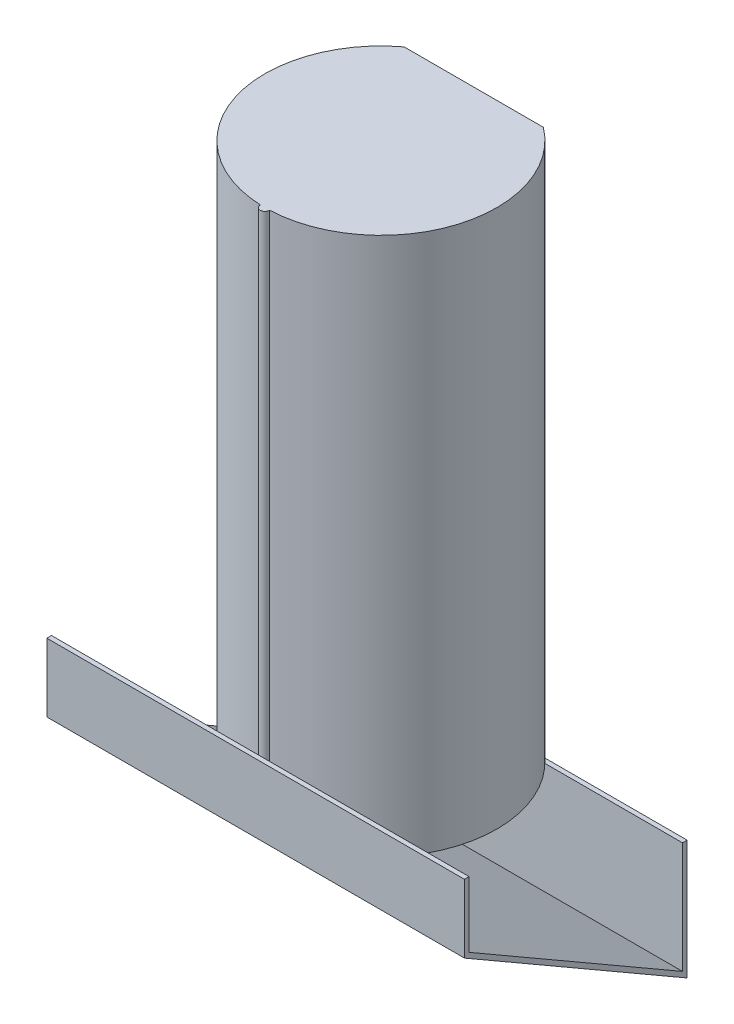
ISO-10303-21;
HEADER;
FILE_DESCRIPTION(('STEP AP214'),'2;1');
FILE_NAME('part.step','',(''),(''),'','','');
FILE_SCHEMA(('AUTOMOTIVE_DESIGN { 1 0 10303 214 1 1 1 1 }'));
ENDSEC;
DATA;
#1=APPLICATION_CONTEXT('core data for automotive mechanical design processes');
#2=APPLICATION_PROTOCOL_DEFINITION('international standard','automotive_design',2000,#1);
#3=PRODUCT_CONTEXT('',#1,'mechanical');
#4=PRODUCT('Part','Part','',(#3));
#5=PRODUCT_RELATED_PRODUCT_CATEGORY('part','',(#4));
#6=PRODUCT_DEFINITION_FORMATION('','',#4);
#7=PRODUCT_DEFINITION_CONTEXT('part definition',#1,'design');
#8=PRODUCT_DEFINITION('design','',#6,#7);
#9=PRODUCT_DEFINITION_SHAPE('','',#8);
#10=(LENGTH_UNIT() NAMED_UNIT(*) SI_UNIT(.MILLI.,.METRE.));
#11=(NAMED_UNIT(*) PLANE_ANGLE_UNIT() SI_UNIT($,.RADIAN.));
#12=(NAMED_UNIT(*) SI_UNIT($,.STERADIAN.) SOLID_ANGLE_UNIT());
#13=UNCERTAINTY_MEASURE_WITH_UNIT(LENGTH_MEASURE(1.E-05),#10,'distance_accuracy_value','');
#14=(GEOMETRIC_REPRESENTATION_CONTEXT(3) GLOBAL_UNCERTAINTY_ASSIGNED_CONTEXT((#13)) GLOBAL_UNIT_ASSIGNED_CONTEXT((#10,
#11,#12)) REPRESENTATION_CONTEXT('',''));
#15=CARTESIAN_POINT('',(0.,0.,0.));
#16=DIRECTION('',(0.,0.,1.));
#17=DIRECTION('',(1.,0.,0.));
#18=AXIS2_PLACEMENT_3D('',#15,#16,#17);
#19=CARTESIAN_POINT('',(22.5,-13.2790561913613,-10.));
#20=DIRECTION('',(0.,0.,-1.));
#21=DIRECTION('',(-1.,0.,0.));
#22=AXIS2_PLACEMENT_3D('',#19,#20,#21);
#23=PLANE('',#22);
#24=DIRECTION('',(0.,-1.,0.));
#25=VECTOR('',#24,1.);
#26=CARTESIAN_POINT('',(-22.5,-13.2790561913613,-10.));
#27=LINE('',#26,#25);
#28=CARTESIAN_POINT('',(-22.5,-1.27905619136129,-10.));
#29=VERTEX_POINT('',#28);
#30=CARTESIAN_POINT('',(-22.5,-13.2790561913613,-10.));
#31=VERTEX_POINT('',#30);
#32=EDGE_CURVE('E139',#29,#31,#27,.T.);
#33=ORIENTED_EDGE('',*,*,#32,.T.);
#34=DIRECTION('',(-1.,0.,0.));
#35=VECTOR('',#34,1.);
#36=CARTESIAN_POINT('',(22.5,-13.2790561913613,-10.));
#37=LINE('',#36,#35);
#38=CARTESIAN_POINT('',(22.5,-13.2790561913613,-10.));
#39=VERTEX_POINT('',#38);
#40=EDGE_CURVE('E12',#39,#31,#37,.T.);
#41=ORIENTED_EDGE('',*,*,#40,.F.);
#42=DIRECTION('',(0.,-1.,0.));
#43=VECTOR('',#42,1.);
#44=CARTESIAN_POINT('',(22.5,-13.2790561913613,-10.));
#45=LINE('',#44,#43);
#46=CARTESIAN_POINT('',(22.5,-1.27905619136129,-10.));
#47=VERTEX_POINT('',#46);
#48=EDGE_CURVE('E153',#47,#39,#45,.T.);
#49=ORIENTED_EDGE('',*,*,#48,.F.);
#50=DIRECTION('',(-1.,0.,0.));
#51=VECTOR('',#50,1.);
#52=CARTESIAN_POINT('',(22.5,-1.27905619136129,-10.));
#53=LINE('',#52,#51);
#54=EDGE_CURVE('E135',#47,#29,#53,.T.);
#55=ORIENTED_EDGE('',*,*,#54,.T.);
#56=EDGE_LOOP('',(#33,#41,#49,#55));
#57=FACE_BOUND('',#56,.T.);
#58=ADVANCED_FACE('F43',(#57),#23,.F.);
#59=CARTESIAN_POINT('',(22.5,0.,13.));
#60=DIRECTION('',(0.,-0.86602540378444,0.499999999999998));
#61=DIRECTION('',(0.,-0.499999999999998,-0.86602540378444));
#62=AXIS2_PLACEMENT_3D('',#59,#60,#61);
#63=PLANE('',#62);
#64=DIRECTION('',(0.,0.499999999999998,0.86602540378444));
#65=VECTOR('',#64,1.);
#66=CARTESIAN_POINT('',(-22.5,0.,13.));
#67=LINE('',#66,#65);
#68=CARTESIAN_POINT('',(-22.5,0.,13.));
#69=VERTEX_POINT('',#68);
#70=EDGE_CURVE('E142',#31,#69,#67,.T.);
#71=ORIENTED_EDGE('',*,*,#70,.T.);
#72=DIRECTION('',(-1.,0.,0.));
#73=VECTOR('',#72,1.);
#74=CARTESIAN_POINT('',(22.5,0.,13.));
#75=LINE('',#74,#73);
#76=CARTESIAN_POINT('',(22.5,0.,13.));
#77=VERTEX_POINT('',#76);
#78=EDGE_CURVE('E51',#77,#69,#75,.T.);
#79=ORIENTED_EDGE('',*,*,#78,.F.);
#80=DIRECTION('',(0.,0.499999999999998,0.86602540378444));
#81=VECTOR('',#80,1.);
#82=CARTESIAN_POINT('',(22.5,0.,13.));
#83=LINE('',#82,#81);
#84=EDGE_CURVE('E102',#39,#77,#83,.T.);
#85=ORIENTED_EDGE('',*,*,#84,.F.);
#86=ORIENTED_EDGE('',*,*,#40,.T.);
#87=EDGE_LOOP('',(#71,#79,#85,#86));
#88=FACE_BOUND('',#87,.T.);
#89=ADVANCED_FACE('F188',(#88),#63,.F.);
#90=CARTESIAN_POINT('',(22.5,0.,13.));
#91=DIRECTION('',(0.,0.,1.));
#92=DIRECTION('',(1.,0.,0.));
#93=AXIS2_PLACEMENT_3D('',#90,#91,#92);
#94=PLANE('',#93);
#95=DIRECTION('',(0.,1.,0.));
#96=VECTOR('',#95,1.);
#97=CARTESIAN_POINT('',(-22.5,0.,13.));
#98=LINE('',#97,#96);
#99=CARTESIAN_POINT('',(-22.5,7.06870368327941,13.));
#100=VERTEX_POINT('',#99);
#101=EDGE_CURVE('E144',#69,#100,#98,.T.);
#102=ORIENTED_EDGE('',*,*,#101,.T.);
#103=DIRECTION('',(-1.,0.,0.));
#104=VECTOR('',#103,1.);
#105=CARTESIAN_POINT('',(22.5,7.06870368327941,13.));
#106=LINE('',#105,#104);
#107=CARTESIAN_POINT('',(22.5,7.06870368327941,13.));
#108=VERTEX_POINT('',#107);
#109=EDGE_CURVE('E160',#108,#100,#106,.T.);
#110=ORIENTED_EDGE('',*,*,#109,.F.);
#111=DIRECTION('',(0.,1.,0.));
#112=VECTOR('',#111,1.);
#113=CARTESIAN_POINT('',(22.5,0.,13.));
#114=LINE('',#113,#112);
#115=EDGE_CURVE('E168',#77,#108,#114,.T.);
#116=ORIENTED_EDGE('',*,*,#115,.F.);
#117=ORIENTED_EDGE('',*,*,#78,.T.);
#118=EDGE_LOOP('',(#102,#110,#116,#117));
#119=FACE_BOUND('',#118,.T.);
#120=ADVANCED_FACE('F166',(#119),#94,.F.);
#121=CARTESIAN_POINT('',(22.5,7.06870368327941,13.));
#122=DIRECTION('',(0.,-1.,0.));
#123=DIRECTION('',(0.,0.,-1.));
#124=AXIS2_PLACEMENT_3D('',#121,#122,#123);
#125=PLANE('',#124);
#126=DIRECTION('',(0.,0.,1.));
#127=VECTOR('',#126,1.);
#128=CARTESIAN_POINT('',(-22.5,7.06870368327941,13.));
#129=LINE('',#128,#127);
#130=CARTESIAN_POINT('',(-22.5,7.06870368327941,13.5));
#131=VERTEX_POINT('',#130);
#132=EDGE_CURVE('E146',#100,#131,#129,.T.);
#133=ORIENTED_EDGE('',*,*,#132,.T.);
#134=DIRECTION('',(-1.,0.,0.));
#135=VECTOR('',#134,1.);
#136=CARTESIAN_POINT('',(22.5,7.06870368327941,13.5));
#137=LINE('',#136,#135);
#138=CARTESIAN_POINT('',(22.5,7.06870368327941,13.5));
#139=VERTEX_POINT('',#138);
#140=EDGE_CURVE('E157',#139,#131,#137,.T.);
#141=ORIENTED_EDGE('',*,*,#140,.F.);
#142=DIRECTION('',(0.,0.,1.));
#143=VECTOR('',#142,1.);
#144=CARTESIAN_POINT('',(22.5,7.06870368327941,13.));
#145=LINE('',#144,#143);
#146=EDGE_CURVE('E180',#108,#139,#145,.T.);
#147=ORIENTED_EDGE('',*,*,#146,.F.);
#148=ORIENTED_EDGE('',*,*,#109,.T.);
#149=EDGE_LOOP('',(#133,#141,#147,#148));
#150=FACE_BOUND('',#149,.T.);
#151=ADVANCED_FACE('F176',(#150),#125,.F.);
#152=CARTESIAN_POINT('',(22.5,7.06870368327941,13.5));
#153=DIRECTION('',(0.,0.,-1.));
#154=DIRECTION('',(0.,1.,0.));
#155=AXIS2_PLACEMENT_3D('',#152,#153,#154);
#156=PLANE('',#155);
#157=DIRECTION('',(0.,-1.,0.));
#158=VECTOR('',#157,1.);
#159=CARTESIAN_POINT('',(-22.5,7.06870368327941,13.5));
#160=LINE('',#159,#158);
#161=CARTESIAN_POINT('',(-22.5,-0.288675134594786,13.5));
#162=VERTEX_POINT('',#161);
#163=EDGE_CURVE('E148',#131,#162,#160,.T.);
#164=ORIENTED_EDGE('',*,*,#163,.T.);
#165=DIRECTION('',(-1.,0.,0.));
#166=VECTOR('',#165,1.);
#167=CARTESIAN_POINT('',(22.5,-0.288675134594786,13.5));
#168=LINE('',#167,#166);
#169=CARTESIAN_POINT('',(22.5,-0.288675134594786,13.5));
#170=VERTEX_POINT('',#169);
#171=EDGE_CURVE('E130',#170,#162,#168,.T.);
#172=ORIENTED_EDGE('',*,*,#171,.F.);
#173=DIRECTION('',(0.,-1.,0.));
#174=VECTOR('',#173,1.);
#175=CARTESIAN_POINT('',(22.5,7.06870368327941,13.5));
#176=LINE('',#175,#174);
#177=EDGE_CURVE('E121',#139,#170,#176,.T.);
#178=ORIENTED_EDGE('',*,*,#177,.F.);
#179=ORIENTED_EDGE('',*,*,#140,.T.);
#180=EDGE_LOOP('',(#164,#172,#178,#179));
#181=FACE_BOUND('',#180,.T.);
#182=ADVANCED_FACE('F179',(#181),#156,.F.);
#183=CARTESIAN_POINT('',(22.5,-0.288675134594786,13.5));
#184=DIRECTION('',(0.,0.86602540378444,-0.499999999999998));
#185=DIRECTION('',(0.,0.499999999999998,0.86602540378444));
#186=AXIS2_PLACEMENT_3D('',#183,#184,#185);
#187=PLANE('',#186);
#188=DIRECTION('',(0.,-0.499999999999998,-0.86602540378444));
#189=VECTOR('',#188,1.);
#190=CARTESIAN_POINT('',(-22.5,-0.288675134594786,13.5));
#191=LINE('',#190,#189);
#192=CARTESIAN_POINT('',(-22.5,-14.1450815951457,-10.5));
#193=VERTEX_POINT('',#192);
#194=EDGE_CURVE('E129',#162,#193,#191,.T.);
#195=ORIENTED_EDGE('',*,*,#194,.T.);
#196=DIRECTION('',(-1.,0.,0.));
#197=VECTOR('',#196,1.);
#198=CARTESIAN_POINT('',(22.5,-14.1450815951457,-10.5));
#199=LINE('',#198,#197);
#200=CARTESIAN_POINT('',(22.5,-14.1450815951457,-10.5));
#201=VERTEX_POINT('',#200);
#202=EDGE_CURVE('E126',#201,#193,#199,.T.);
#203=ORIENTED_EDGE('',*,*,#202,.F.);
#204=DIRECTION('',(0.,-0.499999999999998,-0.86602540378444));
#205=VECTOR('',#204,1.);
#206=CARTESIAN_POINT('',(22.5,-0.288675134594786,13.5));
#207=LINE('',#206,#205);
#208=EDGE_CURVE('E115',#170,#201,#207,.T.);
#209=ORIENTED_EDGE('',*,*,#208,.F.);
#210=ORIENTED_EDGE('',*,*,#171,.T.);
#211=EDGE_LOOP('',(#195,#203,#209,#210));
#212=FACE_BOUND('',#211,.T.);
#213=ADVANCED_FACE('F127',(#212),#187,.F.);
#214=CARTESIAN_POINT('',(22.5,-14.1450815951457,-10.5));
#215=DIRECTION('',(0.,0.,1.));
#216=DIRECTION('',(0.,-1.,0.));
#217=AXIS2_PLACEMENT_3D('',#214,#215,#216);
#218=PLANE('',#217);
#219=DIRECTION('',(0.,1.,0.));
#220=VECTOR('',#219,1.);
#221=CARTESIAN_POINT('',(-22.5,-14.1450815951457,-10.5));
#222=LINE('',#221,#220);
#223=CARTESIAN_POINT('',(-22.5,-1.27905619136128,-10.5));
#224=VERTEX_POINT('',#223);
#225=EDGE_CURVE('E88',#193,#224,#222,.T.);
#226=ORIENTED_EDGE('',*,*,#225,.T.);
#227=DIRECTION('',(-1.,0.,0.));
#228=VECTOR('',#227,1.);
#229=CARTESIAN_POINT('',(22.5,-1.27905619136128,-10.5));
#230=LINE('',#229,#228);
#231=CARTESIAN_POINT('',(22.5,-1.27905619136128,-10.5));
#232=VERTEX_POINT('',#231);
#233=EDGE_CURVE('E131',#232,#224,#230,.T.);
#234=ORIENTED_EDGE('',*,*,#233,.F.);
#235=DIRECTION('',(0.,1.,0.));
#236=VECTOR('',#235,1.);
#237=CARTESIAN_POINT('',(22.5,-14.1450815951457,-10.5));
#238=LINE('',#237,#236);
#239=EDGE_CURVE('E119',#201,#232,#238,.T.);
#240=ORIENTED_EDGE('',*,*,#239,.F.);
#241=ORIENTED_EDGE('',*,*,#202,.T.);
#242=EDGE_LOOP('',(#226,#234,#240,#241));
#243=FACE_BOUND('',#242,.T.);
#244=ADVANCED_FACE('F133',(#243),#218,.F.);
#245=CARTESIAN_POINT('',(22.5,-1.27905619136128,-10.5));
#246=DIRECTION('',(0.,-1.,0.));
#247=DIRECTION('',(0.,0.,-1.));
#248=AXIS2_PLACEMENT_3D('',#245,#246,#247);
#249=PLANE('',#248);
#250=DIRECTION('',(0.,0.,1.));
#251=VECTOR('',#250,1.);
#252=CARTESIAN_POINT('',(-22.5,-1.27905619136128,-10.5));
#253=LINE('',#252,#251);
#254=EDGE_CURVE('E94',#224,#29,#253,.T.);
#255=ORIENTED_EDGE('',*,*,#254,.T.);
#256=ORIENTED_EDGE('',*,*,#54,.F.);
#257=DIRECTION('',(0.,0.,1.));
#258=VECTOR('',#257,1.);
#259=CARTESIAN_POINT('',(22.5,-1.27905619136128,-10.5));
#260=LINE('',#259,#258);
#261=EDGE_CURVE('E59',#232,#47,#260,.T.);
#262=ORIENTED_EDGE('',*,*,#261,.F.);
#263=ORIENTED_EDGE('',*,*,#233,.T.);
#264=EDGE_LOOP('',(#255,#256,#262,#263));
#265=FACE_BOUND('',#264,.T.);
#266=ADVANCED_FACE('F204',(#265),#249,.F.);
#267=CARTESIAN_POINT('',(22.5,0.,0.));
#268=DIRECTION('',(1.,0.,0.));
#269=DIRECTION('',(0.,0.,-1.));
#270=AXIS2_PLACEMENT_3D('',#267,#268,#269);
#271=PLANE('',#270);
#272=ORIENTED_EDGE('',*,*,#48,.T.);
#273=ORIENTED_EDGE('',*,*,#84,.T.);
#274=ORIENTED_EDGE('',*,*,#115,.T.);
#275=ORIENTED_EDGE('',*,*,#146,.T.);
#276=ORIENTED_EDGE('',*,*,#177,.T.);
#277=ORIENTED_EDGE('',*,*,#208,.T.);
#278=ORIENTED_EDGE('',*,*,#239,.T.);
#279=ORIENTED_EDGE('',*,*,#261,.T.);
#280=EDGE_LOOP('',(#272,#273,#274,#275,#276,#277,#278,#279));
#281=FACE_BOUND('',#280,.T.);
#282=ADVANCED_FACE('F117',(#281),#271,.T.);
#283=CARTESIAN_POINT('',(-22.5,0.,0.));
#284=DIRECTION('',(1.,0.,0.));
#285=DIRECTION('',(0.,0.,-1.));
#286=AXIS2_PLACEMENT_3D('',#283,#284,#285);
#287=PLANE('',#286);
#288=ORIENTED_EDGE('',*,*,#32,.F.);
#289=ORIENTED_EDGE('',*,*,#254,.F.);
#290=ORIENTED_EDGE('',*,*,#225,.F.);
#291=ORIENTED_EDGE('',*,*,#194,.F.);
#292=ORIENTED_EDGE('',*,*,#163,.F.);
#293=ORIENTED_EDGE('',*,*,#132,.F.);
#294=ORIENTED_EDGE('',*,*,#101,.F.);
#295=ORIENTED_EDGE('',*,*,#70,.F.);
#296=EDGE_LOOP('',(#288,#289,#290,#291,#292,#293,#294,#295));
#297=FACE_BOUND('',#296,.T.);
#298=ADVANCED_FACE('F172',(#297),#287,.F.);
#299=CLOSED_SHELL('',(#58,#89,#120,#151,#182,#213,#244,#266,#282,#298));
#300=MANIFOLD_SOLID_BREP('B2',#299);
#301=CARTESIAN_POINT('',(0.,58.,0.));
#302=DIRECTION('',(0.,-1.,0.));
#303=DIRECTION('',(0.,0.,-1.));
#304=AXIS2_PLACEMENT_3D('',#301,#302,#303);
#305=CYLINDRICAL_SURFACE('',#304,12.5);
#306=CARTESIAN_POINT('',(0.,0.,0.));
#307=DIRECTION('',(0.,1.,0.));
#308=DIRECTION('',(0.,0.,1.));
#309=AXIS2_PLACEMENT_3D('',#306,#307,#308);
#310=CIRCLE('',#309,12.5);
#311=CARTESIAN_POINT('',(0.499899989997996,0.,12.49));
#312=VERTEX_POINT('',#311);
#313=CARTESIAN_POINT('',(7.5,0.,-10.));
#314=VERTEX_POINT('',#313);
#315=EDGE_CURVE('E334',#312,#314,#310,.T.);
#316=ORIENTED_EDGE('',*,*,#315,.T.);
#317=DIRECTION('',(0.,-1.,0.));
#318=VECTOR('',#317,1.);
#319=CARTESIAN_POINT('',(7.5,58.,-10.));
#320=LINE('',#319,#318);
#321=CARTESIAN_POINT('',(7.5,58.,-10.));
#322=VERTEX_POINT('',#321);
#323=EDGE_CURVE('E41',#322,#314,#320,.T.);
#324=ORIENTED_EDGE('',*,*,#323,.F.);
#325=CARTESIAN_POINT('',(0.,58.,0.));
#326=DIRECTION('',(0.,1.,0.));
#327=DIRECTION('',(0.,0.,1.));
#328=AXIS2_PLACEMENT_3D('',#325,#326,#327);
#329=CIRCLE('',#328,12.5);
#330=CARTESIAN_POINT('',(0.499899989997996,58.,12.49));
#331=VERTEX_POINT('',#330);
#332=EDGE_CURVE('E322',#331,#322,#329,.T.);
#333=ORIENTED_EDGE('',*,*,#332,.F.);
#334=DIRECTION('',(0.,-1.,0.));
#335=VECTOR('',#334,1.);
#336=CARTESIAN_POINT('',(0.499899989997996,58.,12.49));
#337=LINE('',#336,#335);
#338=EDGE_CURVE('E330',#331,#312,#337,.T.);
#339=ORIENTED_EDGE('',*,*,#338,.T.);
#340=EDGE_LOOP('',(#316,#324,#333,#339));
#341=FACE_BOUND('',#340,.T.);
#342=ADVANCED_FACE('F271',(#341),#305,.T.);
#343=CARTESIAN_POINT('',(-7.5,58.,-10.));
#344=DIRECTION('',(0.,0.,1.));
#345=DIRECTION('',(1.,0.,0.));
#346=AXIS2_PLACEMENT_3D('',#343,#344,#345);
#347=PLANE('',#346);
#348=DIRECTION('',(-1.,0.,0.));
#349=VECTOR('',#348,1.);
#350=CARTESIAN_POINT('',(-7.5,0.,-10.));
#351=LINE('',#350,#349);
#352=CARTESIAN_POINT('',(-7.5,0.,-10.));
#353=VERTEX_POINT('',#352);
#354=EDGE_CURVE('E326',#314,#353,#351,.T.);
#355=ORIENTED_EDGE('',*,*,#354,.T.);
#356=DIRECTION('',(0.,-1.,0.));
#357=VECTOR('',#356,1.);
#358=CARTESIAN_POINT('',(-7.5,58.,-10.));
#359=LINE('',#358,#357);
#360=CARTESIAN_POINT('',(-7.5,58.,-10.));
#361=VERTEX_POINT('',#360);
#362=EDGE_CURVE('E279',#361,#353,#359,.T.);
#363=ORIENTED_EDGE('',*,*,#362,.F.);
#364=DIRECTION('',(-1.,0.,0.));
#365=VECTOR('',#364,1.);
#366=CARTESIAN_POINT('',(-7.5,58.,-10.));
#367=LINE('',#366,#365);
#368=EDGE_CURVE('E317',#322,#361,#367,.T.);
#369=ORIENTED_EDGE('',*,*,#368,.F.);
#370=ORIENTED_EDGE('',*,*,#323,.T.);
#371=EDGE_LOOP('',(#355,#363,#369,#370));
#372=FACE_BOUND('',#371,.T.);
#373=ADVANCED_FACE('F325',(#372),#347,.F.);
#374=CARTESIAN_POINT('',(0.,58.,0.));
#375=DIRECTION('',(0.,-1.,0.));
#376=DIRECTION('',(0.,0.,-1.));
#377=AXIS2_PLACEMENT_3D('',#374,#375,#376);
#378=CYLINDRICAL_SURFACE('',#377,12.5);
#379=CARTESIAN_POINT('',(0.,0.,0.));
#380=DIRECTION('',(0.,1.,0.));
#381=DIRECTION('',(0.,0.,1.));
#382=AXIS2_PLACEMENT_3D('',#379,#380,#381);
#383=CIRCLE('',#382,12.5);
#384=CARTESIAN_POINT('',(-0.499899989998,0.,12.49));
#385=VERTEX_POINT('',#384);
#386=EDGE_CURVE('E304',#353,#385,#383,.T.);
#387=ORIENTED_EDGE('',*,*,#386,.T.);
#388=DIRECTION('',(0.,-1.,0.));
#389=VECTOR('',#388,1.);
#390=CARTESIAN_POINT('',(-0.499899989998,58.,12.49));
#391=LINE('',#390,#389);
#392=CARTESIAN_POINT('',(-0.499899989998,58.,12.49));
#393=VERTEX_POINT('',#392);
#394=EDGE_CURVE('E327',#393,#385,#391,.T.);
#395=ORIENTED_EDGE('',*,*,#394,.F.);
#396=CARTESIAN_POINT('',(0.,58.,0.));
#397=DIRECTION('',(0.,1.,0.));
#398=DIRECTION('',(0.,0.,1.));
#399=AXIS2_PLACEMENT_3D('',#396,#397,#398);
#400=CIRCLE('',#399,12.5);
#401=EDGE_CURVE('E320',#361,#393,#400,.T.);
#402=ORIENTED_EDGE('',*,*,#401,.F.);
#403=ORIENTED_EDGE('',*,*,#362,.T.);
#404=EDGE_LOOP('',(#387,#395,#402,#403));
#405=FACE_BOUND('',#404,.T.);
#406=ADVANCED_FACE('F328',(#405),#378,.T.);
#407=CARTESIAN_POINT('',(0.,58.,12.5));
#408=DIRECTION('',(0.,-1.,0.));
#409=DIRECTION('',(0.,0.,-1.));
#410=AXIS2_PLACEMENT_3D('',#407,#408,#409);
#411=CYLINDRICAL_SURFACE('',#410,0.499999999999999);
#412=CARTESIAN_POINT('',(0.,0.,12.5));
#413=DIRECTION('',(0.,1.,0.));
#414=DIRECTION('',(0.,0.,1.));
#415=AXIS2_PLACEMENT_3D('',#412,#413,#414);
#416=CIRCLE('',#415,0.499999999999999);
#417=EDGE_CURVE('E310',#385,#312,#416,.T.);
#418=ORIENTED_EDGE('',*,*,#417,.T.);
#419=ORIENTED_EDGE('',*,*,#338,.F.);
#420=CARTESIAN_POINT('',(0.,58.,12.5));
#421=DIRECTION('',(0.,1.,0.));
#422=DIRECTION('',(0.,0.,1.));
#423=AXIS2_PLACEMENT_3D('',#420,#421,#422);
#424=CIRCLE('',#423,0.499999999999999);
#425=EDGE_CURVE('E287',#393,#331,#424,.T.);
#426=ORIENTED_EDGE('',*,*,#425,.F.);
#427=ORIENTED_EDGE('',*,*,#394,.T.);
#428=EDGE_LOOP('',(#418,#419,#426,#427));
#429=FACE_BOUND('',#428,.T.);
#430=ADVANCED_FACE('F341',(#429),#411,.T.);
#431=CARTESIAN_POINT('',(0.,58.,0.));
#432=DIRECTION('',(0.,1.,0.));
#433=DIRECTION('',(0.,0.,1.));
#434=AXIS2_PLACEMENT_3D('',#431,#432,#433);
#435=PLANE('',#434);
#436=ORIENTED_EDGE('',*,*,#332,.T.);
#437=ORIENTED_EDGE('',*,*,#368,.T.);
#438=ORIENTED_EDGE('',*,*,#401,.T.);
#439=ORIENTED_EDGE('',*,*,#425,.T.);
#440=EDGE_LOOP('',(#436,#437,#438,#439));
#441=FACE_BOUND('',#440,.T.);
#442=ADVANCED_FACE('F318',(#441),#435,.T.);
#443=CARTESIAN_POINT('',(0.,0.,0.));
#444=DIRECTION('',(0.,1.,0.));
#445=DIRECTION('',(0.,0.,1.));
#446=AXIS2_PLACEMENT_3D('',#443,#444,#445);
#447=PLANE('',#446);
#448=ORIENTED_EDGE('',*,*,#315,.F.);
#449=ORIENTED_EDGE('',*,*,#417,.F.);
#450=ORIENTED_EDGE('',*,*,#386,.F.);
#451=ORIENTED_EDGE('',*,*,#354,.F.);
#452=EDGE_LOOP('',(#448,#449,#450,#451));
#453=FACE_BOUND('',#452,.T.);
#454=ADVANCED_FACE('F344',(#453),#447,.F.);
#455=CLOSED_SHELL('',(#342,#373,#406,#430,#442,#454));
#456=MANIFOLD_SOLID_BREP('B6',#455);
#457=ADVANCED_BREP_SHAPE_REPRESENTATION('',(#18,#300,#456),#14);
#458=SHAPE_DEFINITION_REPRESENTATION(#9,#457);
ENDSEC;
END-ISO-10303-21;
